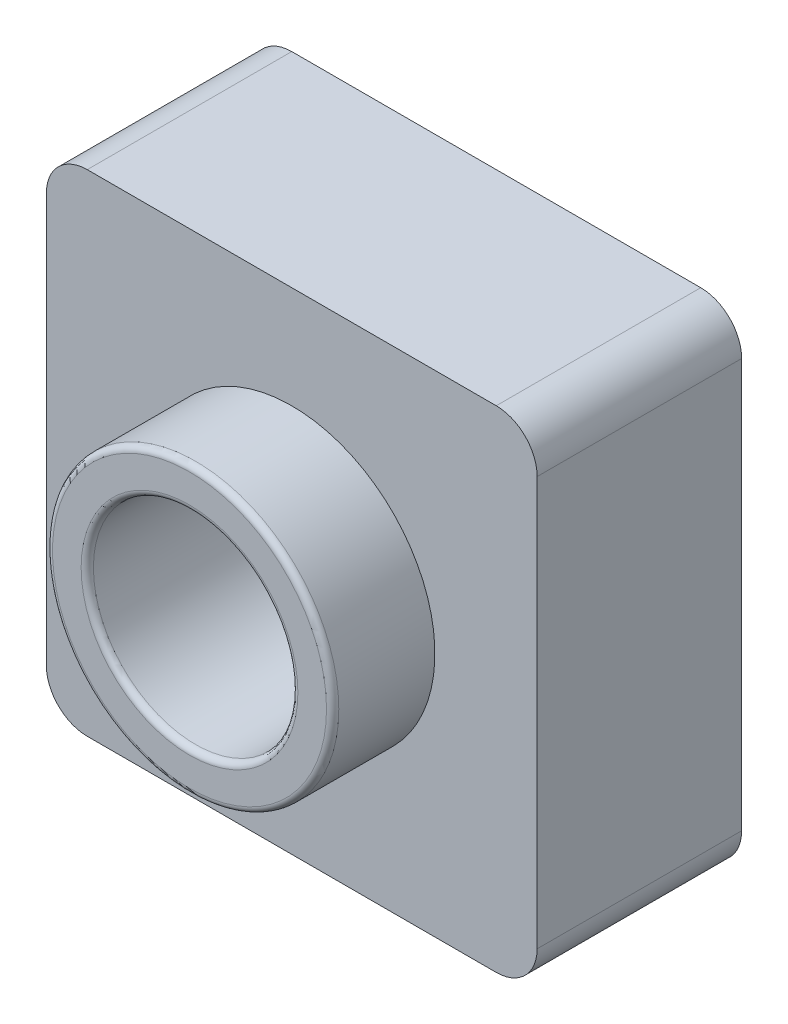
ISO-10303-21;
HEADER;
FILE_DESCRIPTION(('STEP AP214'),'2;1');
FILE_NAME('part.step','',(''),(''),'','','');
FILE_SCHEMA(('AUTOMOTIVE_DESIGN { 1 0 10303 214 1 1 1 1 }'));
ENDSEC;
DATA;
#1=APPLICATION_CONTEXT('core data for automotive mechanical design processes');
#2=APPLICATION_PROTOCOL_DEFINITION('international standard','automotive_design',2000,#1);
#3=PRODUCT_CONTEXT('',#1,'mechanical');
#4=PRODUCT('Part','Part','',(#3));
#5=PRODUCT_RELATED_PRODUCT_CATEGORY('part','',(#4));
#6=PRODUCT_DEFINITION_FORMATION('','',#4);
#7=PRODUCT_DEFINITION_CONTEXT('part definition',#1,'design');
#8=PRODUCT_DEFINITION('design','',#6,#7);
#9=PRODUCT_DEFINITION_SHAPE('','',#8);
#10=(LENGTH_UNIT() NAMED_UNIT(*) SI_UNIT(.MILLI.,.METRE.));
#11=(NAMED_UNIT(*) PLANE_ANGLE_UNIT() SI_UNIT($,.RADIAN.));
#12=(NAMED_UNIT(*) SI_UNIT($,.STERADIAN.) SOLID_ANGLE_UNIT());
#13=UNCERTAINTY_MEASURE_WITH_UNIT(LENGTH_MEASURE(1.E-05),#10,'distance_accuracy_value','');
#14=(GEOMETRIC_REPRESENTATION_CONTEXT(3) GLOBAL_UNCERTAINTY_ASSIGNED_CONTEXT((#13)) GLOBAL_UNIT_ASSIGNED_CONTEXT((#10,
#11,#12)) REPRESENTATION_CONTEXT('',''));
#15=CARTESIAN_POINT('',(0.,0.,0.));
#16=DIRECTION('',(0.,0.,1.));
#17=DIRECTION('',(1.,0.,0.));
#18=AXIS2_PLACEMENT_3D('',#15,#16,#17);
#19=CARTESIAN_POINT('',(0.,0.,0.));
#20=DIRECTION('',(0.,0.,-1.));
#21=DIRECTION('',(-1.,0.,0.));
#22=AXIS2_PLACEMENT_3D('',#19,#20,#21);
#23=PLANE('',#22);
#24=DIRECTION('',(0.,-1.,0.));
#25=VECTOR('',#24,1.);
#26=CARTESIAN_POINT('',(0.,0.,0.));
#27=LINE('',#26,#25);
#28=CARTESIAN_POINT('',(0.,110.,0.));
#29=VERTEX_POINT('',#28);
#30=CARTESIAN_POINT('',(0.,10.,0.));
#31=VERTEX_POINT('',#30);
#32=EDGE_CURVE('E223',#29,#31,#27,.T.);
#33=ORIENTED_EDGE('',*,*,#32,.F.);
#34=CARTESIAN_POINT('',(9.99999999999997,110.,0.));
#35=DIRECTION('',(0.,0.,-1.));
#36=DIRECTION('',(-1.,0.,0.));
#37=AXIS2_PLACEMENT_3D('',#34,#35,#36);
#38=CIRCLE('',#37,10.);
#39=CARTESIAN_POINT('',(9.99999999999997,120.,0.));
#40=VERTEX_POINT('',#39);
#41=EDGE_CURVE('E259',#29,#40,#38,.T.);
#42=ORIENTED_EDGE('',*,*,#41,.T.);
#43=DIRECTION('',(-1.,0.,0.));
#44=VECTOR('',#43,1.);
#45=CARTESIAN_POINT('',(0.,120.,0.));
#46=LINE('',#45,#44);
#47=CARTESIAN_POINT('',(110.,120.,0.));
#48=VERTEX_POINT('',#47);
#49=EDGE_CURVE('E228',#48,#40,#46,.T.);
#50=ORIENTED_EDGE('',*,*,#49,.F.);
#51=CARTESIAN_POINT('',(110.,110.,0.));
#52=DIRECTION('',(0.,0.,-1.));
#53=DIRECTION('',(-1.,0.,0.));
#54=AXIS2_PLACEMENT_3D('',#51,#52,#53);
#55=CIRCLE('',#54,10.);
#56=CARTESIAN_POINT('',(120.,110.,0.));
#57=VERTEX_POINT('',#56);
#58=EDGE_CURVE('E253',#48,#57,#55,.T.);
#59=ORIENTED_EDGE('',*,*,#58,.T.);
#60=DIRECTION('',(0.,1.,0.));
#61=VECTOR('',#60,1.);
#62=CARTESIAN_POINT('',(120.,0.,0.));
#63=LINE('',#62,#61);
#64=CARTESIAN_POINT('',(120.,10.,0.));
#65=VERTEX_POINT('',#64);
#66=EDGE_CURVE('E242',#65,#57,#63,.T.);
#67=ORIENTED_EDGE('',*,*,#66,.F.);
#68=CARTESIAN_POINT('',(110.,10.,0.));
#69=DIRECTION('',(0.,0.,-1.));
#70=DIRECTION('',(-1.,0.,0.));
#71=AXIS2_PLACEMENT_3D('',#68,#69,#70);
#72=CIRCLE('',#71,10.);
#73=CARTESIAN_POINT('',(110.,0.,0.));
#74=VERTEX_POINT('',#73);
#75=EDGE_CURVE('E255',#65,#74,#72,.T.);
#76=ORIENTED_EDGE('',*,*,#75,.T.);
#77=DIRECTION('',(1.,0.,0.));
#78=VECTOR('',#77,1.);
#79=CARTESIAN_POINT('',(0.,0.,0.));
#80=LINE('',#79,#78);
#81=CARTESIAN_POINT('',(10.,0.,0.));
#82=VERTEX_POINT('',#81);
#83=EDGE_CURVE('E239',#82,#74,#80,.T.);
#84=ORIENTED_EDGE('',*,*,#83,.F.);
#85=CARTESIAN_POINT('',(10.,10.,0.));
#86=DIRECTION('',(0.,0.,-1.));
#87=DIRECTION('',(-1.,0.,0.));
#88=AXIS2_PLACEMENT_3D('',#85,#86,#87);
#89=CIRCLE('',#88,10.);
#90=EDGE_CURVE('E257',#82,#31,#89,.T.);
#91=ORIENTED_EDGE('',*,*,#90,.T.);
#92=EDGE_LOOP('',(#33,#42,#50,#59,#67,#76,#84,#91));
#93=FACE_BOUND('',#92,.T.);
#94=CARTESIAN_POINT('',(9.99999999999997,110.,0.));
#95=DIRECTION('',(0.,0.,-1.));
#96=DIRECTION('',(-1.,0.,0.));
#97=AXIS2_PLACEMENT_3D('',#94,#95,#96);
#98=CIRCLE('',#97,8.);
#99=CARTESIAN_POINT('',(1.99999999999997,110.,0.));
#100=VERTEX_POINT('',#99);
#101=CARTESIAN_POINT('',(9.99999999999997,118.,0.));
#102=VERTEX_POINT('',#101);
#103=EDGE_CURVE('E192',#100,#102,#98,.T.);
#104=ORIENTED_EDGE('',*,*,#103,.F.);
#105=DIRECTION('',(0.,-1.,0.));
#106=VECTOR('',#105,1.);
#107=CARTESIAN_POINT('',(2.,0.,0.));
#108=LINE('',#107,#106);
#109=CARTESIAN_POINT('',(2.,10.,0.));
#110=VERTEX_POINT('',#109);
#111=EDGE_CURVE('E176',#100,#110,#108,.T.);
#112=ORIENTED_EDGE('',*,*,#111,.T.);
#113=CARTESIAN_POINT('',(10.,10.,0.));
#114=DIRECTION('',(0.,0.,-1.));
#115=DIRECTION('',(-1.,0.,0.));
#116=AXIS2_PLACEMENT_3D('',#113,#114,#115);
#117=CIRCLE('',#116,8.);
#118=CARTESIAN_POINT('',(10.,2.,0.));
#119=VERTEX_POINT('',#118);
#120=EDGE_CURVE('E210',#119,#110,#117,.T.);
#121=ORIENTED_EDGE('',*,*,#120,.F.);
#122=DIRECTION('',(1.,0.,0.));
#123=VECTOR('',#122,1.);
#124=CARTESIAN_POINT('',(0.,2.,0.));
#125=LINE('',#124,#123);
#126=CARTESIAN_POINT('',(110.,2.,0.));
#127=VERTEX_POINT('',#126);
#128=EDGE_CURVE('E48',#119,#127,#125,.T.);
#129=ORIENTED_EDGE('',*,*,#128,.T.);
#130=CARTESIAN_POINT('',(110.,10.,0.));
#131=DIRECTION('',(0.,0.,-1.));
#132=DIRECTION('',(-1.,0.,0.));
#133=AXIS2_PLACEMENT_3D('',#130,#131,#132);
#134=CIRCLE('',#133,8.);
#135=CARTESIAN_POINT('',(118.,10.,0.));
#136=VERTEX_POINT('',#135);
#137=EDGE_CURVE('E181',#136,#127,#134,.T.);
#138=ORIENTED_EDGE('',*,*,#137,.F.);
#139=DIRECTION('',(0.,1.,0.));
#140=VECTOR('',#139,1.);
#141=CARTESIAN_POINT('',(118.,0.,0.));
#142=LINE('',#141,#140);
#143=CARTESIAN_POINT('',(118.,110.,0.));
#144=VERTEX_POINT('',#143);
#145=EDGE_CURVE('E212',#136,#144,#142,.T.);
#146=ORIENTED_EDGE('',*,*,#145,.T.);
#147=CARTESIAN_POINT('',(110.,110.,0.));
#148=DIRECTION('',(0.,0.,-1.));
#149=DIRECTION('',(-1.,0.,0.));
#150=AXIS2_PLACEMENT_3D('',#147,#148,#149);
#151=CIRCLE('',#150,8.);
#152=CARTESIAN_POINT('',(110.,118.,0.));
#153=VERTEX_POINT('',#152);
#154=EDGE_CURVE('E178',#153,#144,#151,.T.);
#155=ORIENTED_EDGE('',*,*,#154,.F.);
#156=DIRECTION('',(-1.,0.,0.));
#157=VECTOR('',#156,1.);
#158=CARTESIAN_POINT('',(0.,118.,0.));
#159=LINE('',#158,#157);
#160=EDGE_CURVE('E172',#153,#102,#159,.T.);
#161=ORIENTED_EDGE('',*,*,#160,.T.);
#162=EDGE_LOOP('',(#104,#112,#121,#129,#138,#146,#155,#161));
#163=FACE_BOUND('',#162,.T.);
#164=ADVANCED_FACE('F33',(#93,#163),#23,.T.);
#165=CARTESIAN_POINT('',(0.,0.,50.));
#166=DIRECTION('',(0.,0.,-1.));
#167=DIRECTION('',(-1.,0.,0.));
#168=AXIS2_PLACEMENT_3D('',#165,#166,#167);
#169=PLANE('',#168);
#170=DIRECTION('',(-1.,0.,0.));
#171=VECTOR('',#170,1.);
#172=CARTESIAN_POINT('',(0.,120.,50.));
#173=LINE('',#172,#171);
#174=CARTESIAN_POINT('',(110.,120.,50.));
#175=VERTEX_POINT('',#174);
#176=CARTESIAN_POINT('',(9.99999999999997,120.,50.));
#177=VERTEX_POINT('',#176);
#178=EDGE_CURVE('E233',#175,#177,#173,.T.);
#179=ORIENTED_EDGE('',*,*,#178,.T.);
#180=CARTESIAN_POINT('',(9.99999999999997,110.,50.));
#181=DIRECTION('',(0.,0.,-1.));
#182=DIRECTION('',(-1.,0.,0.));
#183=AXIS2_PLACEMENT_3D('',#180,#181,#182);
#184=CIRCLE('',#183,10.);
#185=CARTESIAN_POINT('',(0.,110.,50.));
#186=VERTEX_POINT('',#185);
#187=EDGE_CURVE('E272',#177,#186,#184,.F.);
#188=ORIENTED_EDGE('',*,*,#187,.T.);
#189=DIRECTION('',(0.,-1.,0.));
#190=VECTOR('',#189,1.);
#191=CARTESIAN_POINT('',(0.,0.,50.));
#192=LINE('',#191,#190);
#193=CARTESIAN_POINT('',(0.,10.,50.));
#194=VERTEX_POINT('',#193);
#195=EDGE_CURVE('E224',#186,#194,#192,.T.);
#196=ORIENTED_EDGE('',*,*,#195,.T.);
#197=CARTESIAN_POINT('',(10.,10.,50.));
#198=DIRECTION('',(0.,0.,-1.));
#199=DIRECTION('',(-1.,0.,0.));
#200=AXIS2_PLACEMENT_3D('',#197,#198,#199);
#201=CIRCLE('',#200,10.);
#202=CARTESIAN_POINT('',(10.,0.,50.));
#203=VERTEX_POINT('',#202);
#204=EDGE_CURVE('E270',#194,#203,#201,.F.);
#205=ORIENTED_EDGE('',*,*,#204,.T.);
#206=DIRECTION('',(1.,0.,0.));
#207=VECTOR('',#206,1.);
#208=CARTESIAN_POINT('',(0.,0.,50.));
#209=LINE('',#208,#207);
#210=CARTESIAN_POINT('',(110.,0.,50.));
#211=VERTEX_POINT('',#210);
#212=EDGE_CURVE('E227',#203,#211,#209,.T.);
#213=ORIENTED_EDGE('',*,*,#212,.T.);
#214=CARTESIAN_POINT('',(110.,10.,50.));
#215=DIRECTION('',(0.,0.,-1.));
#216=DIRECTION('',(-1.,0.,0.));
#217=AXIS2_PLACEMENT_3D('',#214,#215,#216);
#218=CIRCLE('',#217,10.);
#219=CARTESIAN_POINT('',(120.,10.,50.));
#220=VERTEX_POINT('',#219);
#221=EDGE_CURVE('E268',#211,#220,#218,.F.);
#222=ORIENTED_EDGE('',*,*,#221,.T.);
#223=DIRECTION('',(0.,1.,0.));
#224=VECTOR('',#223,1.);
#225=CARTESIAN_POINT('',(120.,0.,50.));
#226=LINE('',#225,#224);
#227=CARTESIAN_POINT('',(120.,110.,50.));
#228=VERTEX_POINT('',#227);
#229=EDGE_CURVE('E231',#220,#228,#226,.T.);
#230=ORIENTED_EDGE('',*,*,#229,.T.);
#231=CARTESIAN_POINT('',(110.,110.,50.));
#232=DIRECTION('',(0.,0.,-1.));
#233=DIRECTION('',(-1.,0.,0.));
#234=AXIS2_PLACEMENT_3D('',#231,#232,#233);
#235=CIRCLE('',#234,10.);
#236=EDGE_CURVE('E266',#228,#175,#235,.F.);
#237=ORIENTED_EDGE('',*,*,#236,.T.);
#238=EDGE_LOOP('',(#179,#188,#196,#205,#213,#222,#230,#237));
#239=FACE_BOUND('',#238,.T.);
#240=CARTESIAN_POINT('',(60.,60.,50.));
#241=DIRECTION('',(0.,0.,-1.));
#242=DIRECTION('',(-1.,0.,0.));
#243=AXIS2_PLACEMENT_3D('',#240,#241,#242);
#244=CIRCLE('',#243,35.);
#245=CARTESIAN_POINT('',(25.,60.,50.));
#246=VERTEX_POINT('',#245);
#247=EDGE_CURVE('E236',#246,#246,#244,.F.);
#248=ORIENTED_EDGE('',*,*,#247,.F.);
#249=EDGE_LOOP('',(#248));
#250=FACE_BOUND('',#249,.T.);
#251=ADVANCED_FACE('F333',(#239,#250),#169,.F.);
#252=CARTESIAN_POINT('',(0.,0.,50.));
#253=DIRECTION('',(1.,0.,0.));
#254=DIRECTION('',(0.,1.,0.));
#255=AXIS2_PLACEMENT_3D('',#252,#253,#254);
#256=PLANE('',#255);
#257=ORIENTED_EDGE('',*,*,#195,.F.);
#258=DIRECTION('',(0.,0.,-1.));
#259=VECTOR('',#258,1.);
#260=CARTESIAN_POINT('',(0.,110.,50.));
#261=LINE('',#260,#259);
#262=EDGE_CURVE('E250',#186,#29,#261,.T.);
#263=ORIENTED_EDGE('',*,*,#262,.T.);
#264=ORIENTED_EDGE('',*,*,#32,.T.);
#265=DIRECTION('',(0.,0.,-1.));
#266=VECTOR('',#265,1.);
#267=CARTESIAN_POINT('',(0.,10.,50.));
#268=LINE('',#267,#266);
#269=EDGE_CURVE('E248',#31,#194,#268,.F.);
#270=ORIENTED_EDGE('',*,*,#269,.T.);
#271=EDGE_LOOP('',(#257,#263,#264,#270));
#272=FACE_BOUND('',#271,.T.);
#273=ADVANCED_FACE('F338',(#272),#256,.F.);
#274=CARTESIAN_POINT('',(0.,0.,50.));
#275=DIRECTION('',(0.,1.,0.));
#276=DIRECTION('',(0.,0.,1.));
#277=AXIS2_PLACEMENT_3D('',#274,#275,#276);
#278=PLANE('',#277);
#279=ORIENTED_EDGE('',*,*,#212,.F.);
#280=DIRECTION('',(0.,0.,-1.));
#281=VECTOR('',#280,1.);
#282=CARTESIAN_POINT('',(10.,0.,50.));
#283=LINE('',#282,#281);
#284=EDGE_CURVE('E276',#203,#82,#283,.T.);
#285=ORIENTED_EDGE('',*,*,#284,.T.);
#286=ORIENTED_EDGE('',*,*,#83,.T.);
#287=DIRECTION('',(0.,0.,-1.));
#288=VECTOR('',#287,1.);
#289=CARTESIAN_POINT('',(110.,0.,50.));
#290=LINE('',#289,#288);
#291=EDGE_CURVE('E274',#74,#211,#290,.F.);
#292=ORIENTED_EDGE('',*,*,#291,.T.);
#293=EDGE_LOOP('',(#279,#285,#286,#292));
#294=FACE_BOUND('',#293,.T.);
#295=ADVANCED_FACE('F563',(#294),#278,.F.);
#296=CARTESIAN_POINT('',(120.,0.,50.));
#297=DIRECTION('',(-1.,0.,0.));
#298=DIRECTION('',(0.,-1.,0.));
#299=AXIS2_PLACEMENT_3D('',#296,#297,#298);
#300=PLANE('',#299);
#301=ORIENTED_EDGE('',*,*,#229,.F.);
#302=DIRECTION('',(0.,0.,-1.));
#303=VECTOR('',#302,1.);
#304=CARTESIAN_POINT('',(120.,10.,50.));
#305=LINE('',#304,#303);
#306=EDGE_CURVE('E280',#220,#65,#305,.T.);
#307=ORIENTED_EDGE('',*,*,#306,.T.);
#308=ORIENTED_EDGE('',*,*,#66,.T.);
#309=DIRECTION('',(0.,0.,-1.));
#310=VECTOR('',#309,1.);
#311=CARTESIAN_POINT('',(120.,110.,50.));
#312=LINE('',#311,#310);
#313=EDGE_CURVE('E56',#57,#228,#312,.F.);
#314=ORIENTED_EDGE('',*,*,#313,.T.);
#315=EDGE_LOOP('',(#301,#307,#308,#314));
#316=FACE_BOUND('',#315,.T.);
#317=ADVANCED_FACE('F327',(#316),#300,.F.);
#318=CARTESIAN_POINT('',(0.,120.,50.));
#319=DIRECTION('',(0.,-1.,0.));
#320=DIRECTION('',(0.,0.,-1.));
#321=AXIS2_PLACEMENT_3D('',#318,#319,#320);
#322=PLANE('',#321);
#323=ORIENTED_EDGE('',*,*,#49,.T.);
#324=DIRECTION('',(0.,0.,-1.));
#325=VECTOR('',#324,1.);
#326=CARTESIAN_POINT('',(9.99999999999997,120.,50.));
#327=LINE('',#326,#325);
#328=EDGE_CURVE('E264',#40,#177,#327,.F.);
#329=ORIENTED_EDGE('',*,*,#328,.T.);
#330=ORIENTED_EDGE('',*,*,#178,.F.);
#331=DIRECTION('',(0.,0.,-1.));
#332=VECTOR('',#331,1.);
#333=CARTESIAN_POINT('',(110.,120.,50.));
#334=LINE('',#333,#332);
#335=EDGE_CURVE('E261',#175,#48,#334,.T.);
#336=ORIENTED_EDGE('',*,*,#335,.T.);
#337=EDGE_LOOP('',(#323,#329,#330,#336));
#338=FACE_BOUND('',#337,.T.);
#339=ADVANCED_FACE('F319',(#338),#322,.F.);
#340=CARTESIAN_POINT('',(60.,60.,0.));
#341=DIRECTION('',(0.,0.,-1.));
#342=DIRECTION('',(-1.,0.,0.));
#343=AXIS2_PLACEMENT_3D('',#340,#341,#342);
#344=CIRCLE('',#343,27.);
#345=CARTESIAN_POINT('',(33.,60.,0.));
#346=VERTEX_POINT('',#345);
#347=EDGE_CURVE('E208',#346,#346,#344,.F.);
#348=ORIENTED_EDGE('',*,*,#347,.F.);
#349=EDGE_LOOP('',(#348));
#350=FACE_BOUND('',#349,.T.);
#351=CARTESIAN_POINT('',(60.,60.,0.));
#352=DIRECTION('',(0.,0.,1.));
#353=DIRECTION('',(1.,0.,0.));
#354=AXIS2_PLACEMENT_3D('',#351,#352,#353);
#355=CIRCLE('',#354,25.);
#356=CARTESIAN_POINT('',(85.,60.,0.));
#357=VERTEX_POINT('',#356);
#358=EDGE_CURVE('E206',#357,#357,#355,.T.);
#359=ORIENTED_EDGE('',*,*,#358,.T.);
#360=EDGE_LOOP('',(#359));
#361=FACE_BOUND('',#360,.T.);
#362=ADVANCED_FACE('F317',(#350,#361),#23,.T.);
#363=CARTESIAN_POINT('',(60.,60.,75.));
#364=DIRECTION('',(0.,0.,-1.));
#365=DIRECTION('',(-1.,0.,0.));
#366=AXIS2_PLACEMENT_3D('',#363,#364,#365);
#367=CYLINDRICAL_SURFACE('',#366,35.);
#368=CARTESIAN_POINT('',(60.,60.,73.5));
#369=DIRECTION('',(0.,0.,1.));
#370=DIRECTION('',(1.,0.,0.));
#371=AXIS2_PLACEMENT_3D('',#368,#369,#370);
#372=CIRCLE('',#371,35.);
#373=CARTESIAN_POINT('',(95.,60.,73.5));
#374=VERTEX_POINT('',#373);
#375=EDGE_CURVE('E41',#374,#374,#372,.F.);
#376=ORIENTED_EDGE('',*,*,#375,.T.);
#377=EDGE_LOOP('',(#376));
#378=FACE_BOUND('',#377,.T.);
#379=ORIENTED_EDGE('',*,*,#247,.T.);
#380=EDGE_LOOP('',(#379));
#381=FACE_BOUND('',#380,.T.);
#382=ADVANCED_FACE('F291',(#378,#381),#367,.T.);
#383=CARTESIAN_POINT('',(60.,60.,75.));
#384=DIRECTION('',(0.,0.,1.));
#385=DIRECTION('',(1.,0.,0.));
#386=AXIS2_PLACEMENT_3D('',#383,#384,#385);
#387=PLANE('',#386);
#388=CARTESIAN_POINT('',(60.,60.,75.));
#389=DIRECTION('',(0.,0.,1.));
#390=DIRECTION('',(1.,0.,0.));
#391=AXIS2_PLACEMENT_3D('',#388,#389,#390);
#392=CIRCLE('',#391,33.5);
#393=CARTESIAN_POINT('',(93.5,60.,75.));
#394=VERTEX_POINT('',#393);
#395=EDGE_CURVE('E286',#394,#394,#392,.T.);
#396=ORIENTED_EDGE('',*,*,#395,.T.);
#397=EDGE_LOOP('',(#396));
#398=FACE_BOUND('',#397,.T.);
#399=CARTESIAN_POINT('',(60.,60.,75.));
#400=DIRECTION('',(0.,0.,1.));
#401=DIRECTION('',(1.,0.,0.));
#402=AXIS2_PLACEMENT_3D('',#399,#400,#401);
#403=CIRCLE('',#402,26.5);
#404=CARTESIAN_POINT('',(86.5,60.,75.));
#405=VERTEX_POINT('',#404);
#406=EDGE_CURVE('E283',#405,#405,#403,.F.);
#407=ORIENTED_EDGE('',*,*,#406,.T.);
#408=EDGE_LOOP('',(#407));
#409=FACE_BOUND('',#408,.T.);
#410=ADVANCED_FACE('F300',(#398,#409),#387,.T.);
#411=CARTESIAN_POINT('',(60.,60.,0.));
#412=DIRECTION('',(0.,0.,1.));
#413=DIRECTION('',(1.,0.,0.));
#414=AXIS2_PLACEMENT_3D('',#411,#412,#413);
#415=CYLINDRICAL_SURFACE('',#414,25.);
#416=CARTESIAN_POINT('',(60.,60.,73.5));
#417=DIRECTION('',(0.,0.,1.));
#418=DIRECTION('',(1.,0.,0.));
#419=AXIS2_PLACEMENT_3D('',#416,#417,#418);
#420=CIRCLE('',#419,25.);
#421=CARTESIAN_POINT('',(85.,60.,73.5));
#422=VERTEX_POINT('',#421);
#423=EDGE_CURVE('E11',#422,#422,#420,.T.);
#424=ORIENTED_EDGE('',*,*,#423,.T.);
#425=EDGE_LOOP('',(#424));
#426=FACE_BOUND('',#425,.T.);
#427=ORIENTED_EDGE('',*,*,#358,.F.);
#428=EDGE_LOOP('',(#427));
#429=FACE_BOUND('',#428,.T.);
#430=ADVANCED_FACE('F303',(#426,#429),#415,.F.);
#431=CARTESIAN_POINT('',(9.99999999999997,110.,50.));
#432=DIRECTION('',(0.,0.,-1.));
#433=DIRECTION('',(-1.,0.,0.));
#434=AXIS2_PLACEMENT_3D('',#431,#432,#433);
#435=CYLINDRICAL_SURFACE('',#434,10.);
#436=ORIENTED_EDGE('',*,*,#187,.F.);
#437=ORIENTED_EDGE('',*,*,#328,.F.);
#438=ORIENTED_EDGE('',*,*,#41,.F.);
#439=ORIENTED_EDGE('',*,*,#262,.F.);
#440=EDGE_LOOP('',(#436,#437,#438,#439));
#441=FACE_BOUND('',#440,.T.);
#442=ADVANCED_FACE('F313',(#441),#435,.T.);
#443=CARTESIAN_POINT('',(10.,10.,50.));
#444=DIRECTION('',(0.,0.,-1.));
#445=DIRECTION('',(-1.,0.,0.));
#446=AXIS2_PLACEMENT_3D('',#443,#444,#445);
#447=CYLINDRICAL_SURFACE('',#446,10.);
#448=ORIENTED_EDGE('',*,*,#204,.F.);
#449=ORIENTED_EDGE('',*,*,#269,.F.);
#450=ORIENTED_EDGE('',*,*,#90,.F.);
#451=ORIENTED_EDGE('',*,*,#284,.F.);
#452=EDGE_LOOP('',(#448,#449,#450,#451));
#453=FACE_BOUND('',#452,.T.);
#454=ADVANCED_FACE('F532',(#453),#447,.T.);
#455=CARTESIAN_POINT('',(110.,10.,50.));
#456=DIRECTION('',(0.,0.,-1.));
#457=DIRECTION('',(-1.,0.,0.));
#458=AXIS2_PLACEMENT_3D('',#455,#456,#457);
#459=CYLINDRICAL_SURFACE('',#458,10.);
#460=ORIENTED_EDGE('',*,*,#221,.F.);
#461=ORIENTED_EDGE('',*,*,#291,.F.);
#462=ORIENTED_EDGE('',*,*,#75,.F.);
#463=ORIENTED_EDGE('',*,*,#306,.F.);
#464=EDGE_LOOP('',(#460,#461,#462,#463));
#465=FACE_BOUND('',#464,.T.);
#466=ADVANCED_FACE('F522',(#465),#459,.T.);
#467=CARTESIAN_POINT('',(110.,110.,50.));
#468=DIRECTION('',(0.,0.,-1.));
#469=DIRECTION('',(-1.,0.,0.));
#470=AXIS2_PLACEMENT_3D('',#467,#468,#469);
#471=CYLINDRICAL_SURFACE('',#470,10.);
#472=ORIENTED_EDGE('',*,*,#236,.F.);
#473=ORIENTED_EDGE('',*,*,#313,.F.);
#474=ORIENTED_EDGE('',*,*,#58,.F.);
#475=ORIENTED_EDGE('',*,*,#335,.F.);
#476=EDGE_LOOP('',(#472,#473,#474,#475));
#477=FACE_BOUND('',#476,.T.);
#478=ADVANCED_FACE('F297',(#477),#471,.T.);
#479=CARTESIAN_POINT('',(60.,60.,73.5));
#480=DIRECTION('',(0.,0.,1.));
#481=DIRECTION('',(1.,0.,0.));
#482=AXIS2_PLACEMENT_3D('',#479,#480,#481);
#483=TOROIDAL_SURFACE('',#482,33.5,1.5);
#484=ORIENTED_EDGE('',*,*,#375,.F.);
#485=EDGE_LOOP('',(#484));
#486=FACE_BOUND('',#485,.T.);
#487=ORIENTED_EDGE('',*,*,#395,.F.);
#488=EDGE_LOOP('',(#487));
#489=FACE_BOUND('',#488,.T.);
#490=ADVANCED_FACE('F294',(#486,#489),#483,.T.);
#491=CARTESIAN_POINT('',(60.,60.,73.5));
#492=DIRECTION('',(0.,0.,1.));
#493=DIRECTION('',(1.,0.,0.));
#494=AXIS2_PLACEMENT_3D('',#491,#492,#493);
#495=TOROIDAL_SURFACE('',#494,26.5,1.5);
#496=ORIENTED_EDGE('',*,*,#406,.F.);
#497=EDGE_LOOP('',(#496));
#498=FACE_BOUND('',#497,.T.);
#499=ORIENTED_EDGE('',*,*,#423,.F.);
#500=EDGE_LOOP('',(#499));
#501=FACE_BOUND('',#500,.T.);
#502=ADVANCED_FACE('F35',(#498,#501),#495,.T.);
#503=CARTESIAN_POINT('',(0.,0.,48.));
#504=DIRECTION('',(0.,0.,-1.));
#505=DIRECTION('',(-1.,0.,0.));
#506=AXIS2_PLACEMENT_3D('',#503,#504,#505);
#507=PLANE('',#506);
#508=DIRECTION('',(-1.,0.,0.));
#509=VECTOR('',#508,1.);
#510=CARTESIAN_POINT('',(0.,118.,48.));
#511=LINE('',#510,#509);
#512=CARTESIAN_POINT('',(110.,118.,48.));
#513=VERTEX_POINT('',#512);
#514=CARTESIAN_POINT('',(9.99999999999997,118.,48.));
#515=VERTEX_POINT('',#514);
#516=EDGE_CURVE('E348',#513,#515,#511,.T.);
#517=ORIENTED_EDGE('',*,*,#516,.F.);
#518=CARTESIAN_POINT('',(110.,110.,48.));
#519=DIRECTION('',(0.,0.,-1.));
#520=DIRECTION('',(-1.,0.,0.));
#521=AXIS2_PLACEMENT_3D('',#518,#519,#520);
#522=CIRCLE('',#521,8.);
#523=CARTESIAN_POINT('',(118.,110.,48.));
#524=VERTEX_POINT('',#523);
#525=EDGE_CURVE('E189',#524,#513,#522,.F.);
#526=ORIENTED_EDGE('',*,*,#525,.F.);
#527=DIRECTION('',(0.,1.,0.));
#528=VECTOR('',#527,1.);
#529=CARTESIAN_POINT('',(118.,0.,48.));
#530=LINE('',#529,#528);
#531=CARTESIAN_POINT('',(118.,10.,48.));
#532=VERTEX_POINT('',#531);
#533=EDGE_CURVE('E350',#532,#524,#530,.T.);
#534=ORIENTED_EDGE('',*,*,#533,.F.);
#535=CARTESIAN_POINT('',(110.,10.,48.));
#536=DIRECTION('',(0.,0.,-1.));
#537=DIRECTION('',(-1.,0.,0.));
#538=AXIS2_PLACEMENT_3D('',#535,#536,#537);
#539=CIRCLE('',#538,8.);
#540=CARTESIAN_POINT('',(110.,2.,48.));
#541=VERTEX_POINT('',#540);
#542=EDGE_CURVE('E357',#541,#532,#539,.F.);
#543=ORIENTED_EDGE('',*,*,#542,.F.);
#544=DIRECTION('',(1.,0.,0.));
#545=VECTOR('',#544,1.);
#546=CARTESIAN_POINT('',(0.,2.,48.));
#547=LINE('',#546,#545);
#548=CARTESIAN_POINT('',(10.,2.,48.));
#549=VERTEX_POINT('',#548);
#550=EDGE_CURVE('E171',#549,#541,#547,.T.);
#551=ORIENTED_EDGE('',*,*,#550,.F.);
#552=CARTESIAN_POINT('',(10.,10.,48.));
#553=DIRECTION('',(0.,0.,-1.));
#554=DIRECTION('',(-1.,0.,0.));
#555=AXIS2_PLACEMENT_3D('',#552,#553,#554);
#556=CIRCLE('',#555,8.);
#557=CARTESIAN_POINT('',(2.,10.,48.));
#558=VERTEX_POINT('',#557);
#559=EDGE_CURVE('E161',#558,#549,#556,.F.);
#560=ORIENTED_EDGE('',*,*,#559,.F.);
#561=DIRECTION('',(0.,-1.,0.));
#562=VECTOR('',#561,1.);
#563=CARTESIAN_POINT('',(2.,0.,48.));
#564=LINE('',#563,#562);
#565=CARTESIAN_POINT('',(1.99999999999997,110.,48.));
#566=VERTEX_POINT('',#565);
#567=EDGE_CURVE('E165',#566,#558,#564,.T.);
#568=ORIENTED_EDGE('',*,*,#567,.F.);
#569=CARTESIAN_POINT('',(9.99999999999997,110.,48.));
#570=DIRECTION('',(0.,0.,-1.));
#571=DIRECTION('',(-1.,0.,0.));
#572=AXIS2_PLACEMENT_3D('',#569,#570,#571);
#573=CIRCLE('',#572,8.);
#574=EDGE_CURVE('E149',#515,#566,#573,.F.);
#575=ORIENTED_EDGE('',*,*,#574,.F.);
#576=EDGE_LOOP('',(#517,#526,#534,#543,#551,#560,#568,#575));
#577=FACE_BOUND('',#576,.T.);
#578=CARTESIAN_POINT('',(60.,60.,48.));
#579=DIRECTION('',(0.,0.,-1.));
#580=DIRECTION('',(-1.,0.,0.));
#581=AXIS2_PLACEMENT_3D('',#578,#579,#580);
#582=CIRCLE('',#581,33.);
#583=CARTESIAN_POINT('',(27.,60.,48.));
#584=VERTEX_POINT('',#583);
#585=EDGE_CURVE('E183',#584,#584,#582,.F.);
#586=ORIENTED_EDGE('',*,*,#585,.T.);
#587=EDGE_LOOP('',(#586));
#588=FACE_BOUND('',#587,.T.);
#589=ADVANCED_FACE('F166',(#577,#588),#507,.T.);
#590=CARTESIAN_POINT('',(2.,0.,50.));
#591=DIRECTION('',(1.,0.,0.));
#592=DIRECTION('',(0.,1.,0.));
#593=AXIS2_PLACEMENT_3D('',#590,#591,#592);
#594=PLANE('',#593);
#595=ORIENTED_EDGE('',*,*,#567,.T.);
#596=DIRECTION('',(0.,0.,1.));
#597=VECTOR('',#596,1.);
#598=CARTESIAN_POINT('',(2.,10.,50.));
#599=LINE('',#598,#597);
#600=EDGE_CURVE('E179',#110,#558,#599,.T.);
#601=ORIENTED_EDGE('',*,*,#600,.F.);
#602=ORIENTED_EDGE('',*,*,#111,.F.);
#603=DIRECTION('',(0.,0.,1.));
#604=VECTOR('',#603,1.);
#605=CARTESIAN_POINT('',(1.99999999999997,110.,50.));
#606=LINE('',#605,#604);
#607=EDGE_CURVE('E153',#566,#100,#606,.F.);
#608=ORIENTED_EDGE('',*,*,#607,.F.);
#609=EDGE_LOOP('',(#595,#601,#602,#608));
#610=FACE_BOUND('',#609,.T.);
#611=ADVANCED_FACE('F174',(#610),#594,.T.);
#612=CARTESIAN_POINT('',(0.,2.,50.));
#613=DIRECTION('',(0.,1.,0.));
#614=DIRECTION('',(0.,0.,1.));
#615=AXIS2_PLACEMENT_3D('',#612,#613,#614);
#616=PLANE('',#615);
#617=ORIENTED_EDGE('',*,*,#550,.T.);
#618=DIRECTION('',(0.,0.,1.));
#619=VECTOR('',#618,1.);
#620=CARTESIAN_POINT('',(110.,2.,50.));
#621=LINE('',#620,#619);
#622=EDGE_CURVE('E160',#127,#541,#621,.T.);
#623=ORIENTED_EDGE('',*,*,#622,.F.);
#624=ORIENTED_EDGE('',*,*,#128,.F.);
#625=DIRECTION('',(0.,0.,1.));
#626=VECTOR('',#625,1.);
#627=CARTESIAN_POINT('',(10.,2.,50.));
#628=LINE('',#627,#626);
#629=EDGE_CURVE('E196',#549,#119,#628,.F.);
#630=ORIENTED_EDGE('',*,*,#629,.F.);
#631=EDGE_LOOP('',(#617,#623,#624,#630));
#632=FACE_BOUND('',#631,.T.);
#633=ADVANCED_FACE('F372',(#632),#616,.T.);
#634=CARTESIAN_POINT('',(118.,0.,50.));
#635=DIRECTION('',(-1.,0.,0.));
#636=DIRECTION('',(0.,-1.,0.));
#637=AXIS2_PLACEMENT_3D('',#634,#635,#636);
#638=PLANE('',#637);
#639=ORIENTED_EDGE('',*,*,#533,.T.);
#640=DIRECTION('',(0.,0.,1.));
#641=VECTOR('',#640,1.);
#642=CARTESIAN_POINT('',(118.,110.,50.));
#643=LINE('',#642,#641);
#644=EDGE_CURVE('E193',#144,#524,#643,.T.);
#645=ORIENTED_EDGE('',*,*,#644,.F.);
#646=ORIENTED_EDGE('',*,*,#145,.F.);
#647=DIRECTION('',(0.,0.,1.));
#648=VECTOR('',#647,1.);
#649=CARTESIAN_POINT('',(118.,10.,50.));
#650=LINE('',#649,#648);
#651=EDGE_CURVE('E195',#532,#136,#650,.F.);
#652=ORIENTED_EDGE('',*,*,#651,.F.);
#653=EDGE_LOOP('',(#639,#645,#646,#652));
#654=FACE_BOUND('',#653,.T.);
#655=ADVANCED_FACE('F368',(#654),#638,.T.);
#656=CARTESIAN_POINT('',(0.,118.,50.));
#657=DIRECTION('',(0.,-1.,0.));
#658=DIRECTION('',(0.,0.,-1.));
#659=AXIS2_PLACEMENT_3D('',#656,#657,#658);
#660=PLANE('',#659);
#661=ORIENTED_EDGE('',*,*,#160,.F.);
#662=DIRECTION('',(0.,0.,-1.));
#663=VECTOR('',#662,1.);
#664=CARTESIAN_POINT('',(110.,118.,50.));
#665=LINE('',#664,#663);
#666=EDGE_CURVE('E190',#513,#153,#665,.T.);
#667=ORIENTED_EDGE('',*,*,#666,.F.);
#668=ORIENTED_EDGE('',*,*,#516,.T.);
#669=DIRECTION('',(0.,0.,-1.));
#670=VECTOR('',#669,1.);
#671=CARTESIAN_POINT('',(9.99999999999997,118.,50.));
#672=LINE('',#671,#670);
#673=EDGE_CURVE('E156',#102,#515,#672,.F.);
#674=ORIENTED_EDGE('',*,*,#673,.F.);
#675=EDGE_LOOP('',(#661,#667,#668,#674));
#676=FACE_BOUND('',#675,.T.);
#677=ADVANCED_FACE('F346',(#676),#660,.T.);
#678=CARTESIAN_POINT('',(60.,60.,75.));
#679=DIRECTION('',(0.,0.,-1.));
#680=DIRECTION('',(-1.,0.,0.));
#681=AXIS2_PLACEMENT_3D('',#678,#679,#680);
#682=CYLINDRICAL_SURFACE('',#681,33.);
#683=CARTESIAN_POINT('',(60.,60.,73.));
#684=DIRECTION('',(0.,0.,1.));
#685=DIRECTION('',(1.,0.,0.));
#686=AXIS2_PLACEMENT_3D('',#683,#684,#685);
#687=CIRCLE('',#686,33.);
#688=CARTESIAN_POINT('',(93.,60.,73.));
#689=VERTEX_POINT('',#688);
#690=EDGE_CURVE('E198',#689,#689,#687,.T.);
#691=ORIENTED_EDGE('',*,*,#690,.T.);
#692=EDGE_LOOP('',(#691));
#693=FACE_BOUND('',#692,.T.);
#694=ORIENTED_EDGE('',*,*,#585,.F.);
#695=EDGE_LOOP('',(#694));
#696=FACE_BOUND('',#695,.T.);
#697=ADVANCED_FACE('F421',(#693,#696),#682,.F.);
#698=CARTESIAN_POINT('',(60.,60.,73.));
#699=DIRECTION('',(0.,0.,1.));
#700=DIRECTION('',(1.,0.,0.));
#701=AXIS2_PLACEMENT_3D('',#698,#699,#700);
#702=PLANE('',#701);
#703=ORIENTED_EDGE('',*,*,#690,.F.);
#704=EDGE_LOOP('',(#703));
#705=FACE_BOUND('',#704,.T.);
#706=CARTESIAN_POINT('',(60.,60.,73.));
#707=DIRECTION('',(0.,0.,1.));
#708=DIRECTION('',(1.,0.,0.));
#709=AXIS2_PLACEMENT_3D('',#706,#707,#708);
#710=CIRCLE('',#709,27.);
#711=CARTESIAN_POINT('',(87.,60.,73.));
#712=VERTEX_POINT('',#711);
#713=EDGE_CURVE('E203',#712,#712,#710,.T.);
#714=ORIENTED_EDGE('',*,*,#713,.T.);
#715=EDGE_LOOP('',(#714));
#716=FACE_BOUND('',#715,.T.);
#717=ADVANCED_FACE('F412',(#705,#716),#702,.F.);
#718=CARTESIAN_POINT('',(60.,60.,0.));
#719=DIRECTION('',(0.,0.,1.));
#720=DIRECTION('',(1.,0.,0.));
#721=AXIS2_PLACEMENT_3D('',#718,#719,#720);
#722=CYLINDRICAL_SURFACE('',#721,27.);
#723=ORIENTED_EDGE('',*,*,#713,.F.);
#724=EDGE_LOOP('',(#723));
#725=FACE_BOUND('',#724,.T.);
#726=ORIENTED_EDGE('',*,*,#347,.T.);
#727=EDGE_LOOP('',(#726));
#728=FACE_BOUND('',#727,.T.);
#729=ADVANCED_FACE('F382',(#725,#728),#722,.T.);
#730=CARTESIAN_POINT('',(9.99999999999997,110.,50.));
#731=DIRECTION('',(0.,0.,-1.));
#732=DIRECTION('',(-1.,0.,0.));
#733=AXIS2_PLACEMENT_3D('',#730,#731,#732);
#734=CYLINDRICAL_SURFACE('',#733,8.);
#735=ORIENTED_EDGE('',*,*,#574,.T.);
#736=ORIENTED_EDGE('',*,*,#607,.T.);
#737=ORIENTED_EDGE('',*,*,#103,.T.);
#738=ORIENTED_EDGE('',*,*,#673,.T.);
#739=EDGE_LOOP('',(#735,#736,#737,#738));
#740=FACE_BOUND('',#739,.T.);
#741=ADVANCED_FACE('F151',(#740),#734,.F.);
#742=CARTESIAN_POINT('',(10.,10.,50.));
#743=DIRECTION('',(0.,0.,-1.));
#744=DIRECTION('',(-1.,0.,0.));
#745=AXIS2_PLACEMENT_3D('',#742,#743,#744);
#746=CYLINDRICAL_SURFACE('',#745,8.);
#747=ORIENTED_EDGE('',*,*,#559,.T.);
#748=ORIENTED_EDGE('',*,*,#629,.T.);
#749=ORIENTED_EDGE('',*,*,#120,.T.);
#750=ORIENTED_EDGE('',*,*,#600,.T.);
#751=EDGE_LOOP('',(#747,#748,#749,#750));
#752=FACE_BOUND('',#751,.T.);
#753=ADVANCED_FACE('F374',(#752),#746,.F.);
#754=CARTESIAN_POINT('',(110.,10.,50.));
#755=DIRECTION('',(0.,0.,-1.));
#756=DIRECTION('',(-1.,0.,0.));
#757=AXIS2_PLACEMENT_3D('',#754,#755,#756);
#758=CYLINDRICAL_SURFACE('',#757,8.);
#759=ORIENTED_EDGE('',*,*,#542,.T.);
#760=ORIENTED_EDGE('',*,*,#651,.T.);
#761=ORIENTED_EDGE('',*,*,#137,.T.);
#762=ORIENTED_EDGE('',*,*,#622,.T.);
#763=EDGE_LOOP('',(#759,#760,#761,#762));
#764=FACE_BOUND('',#763,.T.);
#765=ADVANCED_FACE('F371',(#764),#758,.F.);
#766=CARTESIAN_POINT('',(110.,110.,50.));
#767=DIRECTION('',(0.,0.,-1.));
#768=DIRECTION('',(-1.,0.,0.));
#769=AXIS2_PLACEMENT_3D('',#766,#767,#768);
#770=CYLINDRICAL_SURFACE('',#769,8.);
#771=ORIENTED_EDGE('',*,*,#525,.T.);
#772=ORIENTED_EDGE('',*,*,#666,.T.);
#773=ORIENTED_EDGE('',*,*,#154,.T.);
#774=ORIENTED_EDGE('',*,*,#644,.T.);
#775=EDGE_LOOP('',(#771,#772,#773,#774));
#776=FACE_BOUND('',#775,.T.);
#777=ADVANCED_FACE('F361',(#776),#770,.F.);
#778=CLOSED_SHELL('',(#164,#251,#273,#295,#317,#339,#362,#382,#410,#430,#442,#454,#466,#478,
#490,#502,#589,#611,#633,#655,#677,#697,#717,#729,#741,#753,#765,#777));
#779=MANIFOLD_SOLID_BREP('B2',#778);
#780=ADVANCED_BREP_SHAPE_REPRESENTATION('',(#18,#779),#14);
#781=SHAPE_DEFINITION_REPRESENTATION(#9,#780);
ENDSEC;
END-ISO-10303-21;
